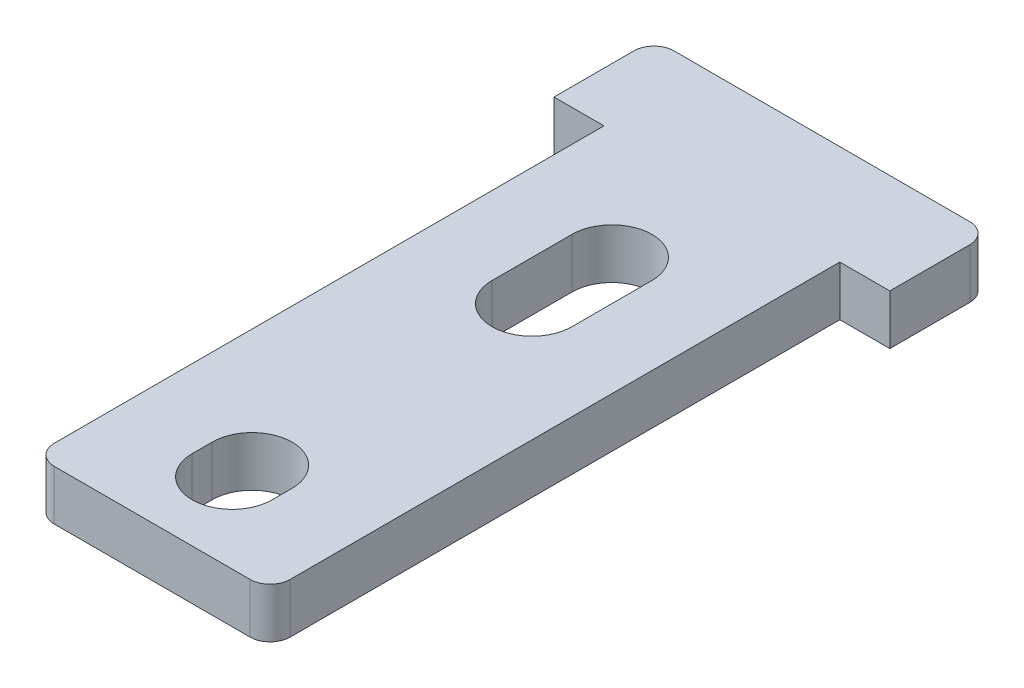
ISO-10303-21;
HEADER;
FILE_DESCRIPTION(('STEP AP214'),'2;1');
FILE_NAME('part.step','',(''),(''),'','','');
FILE_SCHEMA(('AUTOMOTIVE_DESIGN { 1 0 10303 214 1 1 1 1 }'));
ENDSEC;
DATA;
#1=APPLICATION_CONTEXT('core data for automotive mechanical design processes');
#2=APPLICATION_PROTOCOL_DEFINITION('international standard','automotive_design',2000,#1);
#3=PRODUCT_CONTEXT('',#1,'mechanical');
#4=PRODUCT('Part','Part','',(#3));
#5=PRODUCT_RELATED_PRODUCT_CATEGORY('part','',(#4));
#6=PRODUCT_DEFINITION_FORMATION('','',#4);
#7=PRODUCT_DEFINITION_CONTEXT('part definition',#1,'design');
#8=PRODUCT_DEFINITION('design','',#6,#7);
#9=PRODUCT_DEFINITION_SHAPE('','',#8);
#10=(LENGTH_UNIT() NAMED_UNIT(*) SI_UNIT(.MILLI.,.METRE.));
#11=(NAMED_UNIT(*) PLANE_ANGLE_UNIT() SI_UNIT($,.RADIAN.));
#12=(NAMED_UNIT(*) SI_UNIT($,.STERADIAN.) SOLID_ANGLE_UNIT());
#13=UNCERTAINTY_MEASURE_WITH_UNIT(LENGTH_MEASURE(1.E-05),#10,'distance_accuracy_value','');
#14=(GEOMETRIC_REPRESENTATION_CONTEXT(3) GLOBAL_UNCERTAINTY_ASSIGNED_CONTEXT((#13)) GLOBAL_UNIT_ASSIGNED_CONTEXT((#10,
#11,#12)) REPRESENTATION_CONTEXT('',''));
#15=CARTESIAN_POINT('',(0.,0.,0.));
#16=DIRECTION('',(0.,0.,1.));
#17=DIRECTION('',(1.,0.,0.));
#18=AXIS2_PLACEMENT_3D('',#15,#16,#17);
#19=CARTESIAN_POINT('',(0.,2.5,-33.5));
#20=DIRECTION('',(0.,0.,-1.));
#21=DIRECTION('',(-1.,0.,0.));
#22=AXIS2_PLACEMENT_3D('',#19,#20,#21);
#23=PLANE('',#22);
#24=DIRECTION('',(1.,0.,0.));
#25=VECTOR('',#24,1.);
#26=CARTESIAN_POINT('',(0.,0.,-33.5));
#27=LINE('',#26,#25);
#28=CARTESIAN_POINT('',(-2.49999999999999,0.,-33.5));
#29=VERTEX_POINT('',#28);
#30=CARTESIAN_POINT('',(12.3,0.,-33.5));
#31=VERTEX_POINT('',#30);
#32=EDGE_CURVE('E272',#29,#31,#27,.T.);
#33=ORIENTED_EDGE('',*,*,#32,.F.);
#34=DIRECTION('',(0.,-1.,0.));
#35=VECTOR('',#34,1.);
#36=CARTESIAN_POINT('',(-2.49999999999999,2.5,-33.5));
#37=LINE('',#36,#35);
#38=CARTESIAN_POINT('',(-2.49999999999999,2.5,-33.5));
#39=VERTEX_POINT('',#38);
#40=EDGE_CURVE('E11',#39,#29,#37,.T.);
#41=ORIENTED_EDGE('',*,*,#40,.F.);
#42=DIRECTION('',(1.,0.,0.));
#43=VECTOR('',#42,1.);
#44=CARTESIAN_POINT('',(0.,2.5,-33.5));
#45=LINE('',#44,#43);
#46=CARTESIAN_POINT('',(12.3,2.5,-33.5));
#47=VERTEX_POINT('',#46);
#48=EDGE_CURVE('E324',#39,#47,#45,.T.);
#49=ORIENTED_EDGE('',*,*,#48,.T.);
#50=DIRECTION('',(0.,-1.,0.));
#51=VECTOR('',#50,1.);
#52=CARTESIAN_POINT('',(12.3,2.5,-33.5));
#53=LINE('',#52,#51);
#54=EDGE_CURVE('E52',#47,#31,#53,.T.);
#55=ORIENTED_EDGE('',*,*,#54,.T.);
#56=EDGE_LOOP('',(#33,#41,#49,#55));
#57=FACE_BOUND('',#56,.T.);
#58=ADVANCED_FACE('F33',(#57),#23,.T.);
#59=CARTESIAN_POINT('',(-2.5,2.5,-32.5));
#60=DIRECTION('',(0.,-1.,0.));
#61=DIRECTION('',(0.,0.,-1.));
#62=AXIS2_PLACEMENT_3D('',#59,#60,#61);
#63=CYLINDRICAL_SURFACE('',#62,1.);
#64=CARTESIAN_POINT('',(-2.5,0.,-32.5));
#65=DIRECTION('',(0.,1.,0.));
#66=DIRECTION('',(0.,0.,1.));
#67=AXIS2_PLACEMENT_3D('',#64,#65,#66);
#68=CIRCLE('',#67,1.);
#69=CARTESIAN_POINT('',(-3.5,0.,-32.5));
#70=VERTEX_POINT('',#69);
#71=EDGE_CURVE('E274',#29,#70,#68,.T.);
#72=ORIENTED_EDGE('',*,*,#71,.T.);
#73=DIRECTION('',(0.,-1.,0.));
#74=VECTOR('',#73,1.);
#75=CARTESIAN_POINT('',(-3.5,2.5,-32.5));
#76=LINE('',#75,#74);
#77=CARTESIAN_POINT('',(-3.5,2.5,-32.5));
#78=VERTEX_POINT('',#77);
#79=EDGE_CURVE('E43',#78,#70,#76,.T.);
#80=ORIENTED_EDGE('',*,*,#79,.F.);
#81=CARTESIAN_POINT('',(-2.5,2.5,-32.5));
#82=DIRECTION('',(0.,1.,0.));
#83=DIRECTION('',(0.,0.,1.));
#84=AXIS2_PLACEMENT_3D('',#81,#82,#83);
#85=CIRCLE('',#84,1.);
#86=EDGE_CURVE('E326',#39,#78,#85,.T.);
#87=ORIENTED_EDGE('',*,*,#86,.F.);
#88=ORIENTED_EDGE('',*,*,#40,.T.);
#89=EDGE_LOOP('',(#72,#80,#87,#88));
#90=FACE_BOUND('',#89,.T.);
#91=ADVANCED_FACE('F351',(#90),#63,.T.);
#92=CARTESIAN_POINT('',(-3.5,2.5,0.));
#93=DIRECTION('',(-1.,0.,0.));
#94=DIRECTION('',(0.,0.,1.));
#95=AXIS2_PLACEMENT_3D('',#92,#93,#94);
#96=PLANE('',#95);
#97=DIRECTION('',(0.,0.,-1.));
#98=VECTOR('',#97,1.);
#99=CARTESIAN_POINT('',(-3.5,0.,0.));
#100=LINE('',#99,#98);
#101=CARTESIAN_POINT('',(-3.5,0.,-28.5));
#102=VERTEX_POINT('',#101);
#103=EDGE_CURVE('E277',#102,#70,#100,.T.);
#104=ORIENTED_EDGE('',*,*,#103,.F.);
#105=DIRECTION('',(0.,-1.,0.));
#106=VECTOR('',#105,1.);
#107=CARTESIAN_POINT('',(-3.5,2.5,-28.5));
#108=LINE('',#107,#106);
#109=CARTESIAN_POINT('',(-3.5,2.5,-28.5));
#110=VERTEX_POINT('',#109);
#111=EDGE_CURVE('E217',#110,#102,#108,.T.);
#112=ORIENTED_EDGE('',*,*,#111,.F.);
#113=DIRECTION('',(0.,0.,-1.));
#114=VECTOR('',#113,1.);
#115=CARTESIAN_POINT('',(-3.5,2.5,0.));
#116=LINE('',#115,#114);
#117=EDGE_CURVE('E328',#110,#78,#116,.T.);
#118=ORIENTED_EDGE('',*,*,#117,.T.);
#119=ORIENTED_EDGE('',*,*,#79,.T.);
#120=EDGE_LOOP('',(#104,#112,#118,#119));
#121=FACE_BOUND('',#120,.T.);
#122=ADVANCED_FACE('F354',(#121),#96,.T.);
#123=CARTESIAN_POINT('',(0.,2.5,-28.5));
#124=DIRECTION('',(0.,0.,1.));
#125=DIRECTION('',(1.,0.,0.));
#126=AXIS2_PLACEMENT_3D('',#123,#124,#125);
#127=PLANE('',#126);
#128=DIRECTION('',(-1.,0.,0.));
#129=VECTOR('',#128,1.);
#130=CARTESIAN_POINT('',(0.,0.,-28.5));
#131=LINE('',#130,#129);
#132=CARTESIAN_POINT('',(-1.,0.,-28.5));
#133=VERTEX_POINT('',#132);
#134=EDGE_CURVE('E280',#133,#102,#131,.T.);
#135=ORIENTED_EDGE('',*,*,#134,.F.);
#136=DIRECTION('',(0.,-1.,0.));
#137=VECTOR('',#136,1.);
#138=CARTESIAN_POINT('',(-1.,2.5,-28.5));
#139=LINE('',#138,#137);
#140=CARTESIAN_POINT('',(-1.,2.5,-28.5));
#141=VERTEX_POINT('',#140);
#142=EDGE_CURVE('E215',#141,#133,#139,.T.);
#143=ORIENTED_EDGE('',*,*,#142,.F.);
#144=DIRECTION('',(-1.,0.,0.));
#145=VECTOR('',#144,1.);
#146=CARTESIAN_POINT('',(0.,2.5,-28.5));
#147=LINE('',#146,#145);
#148=EDGE_CURVE('E331',#141,#110,#147,.T.);
#149=ORIENTED_EDGE('',*,*,#148,.T.);
#150=ORIENTED_EDGE('',*,*,#111,.T.);
#151=EDGE_LOOP('',(#135,#143,#149,#150));
#152=FACE_BOUND('',#151,.T.);
#153=ADVANCED_FACE('F359',(#152),#127,.T.);
#154=CARTESIAN_POINT('',(-1.,2.5,0.));
#155=DIRECTION('',(-1.,0.,0.));
#156=DIRECTION('',(0.,0.,1.));
#157=AXIS2_PLACEMENT_3D('',#154,#155,#156);
#158=PLANE('',#157);
#159=DIRECTION('',(0.,0.,-1.));
#160=VECTOR('',#159,1.);
#161=CARTESIAN_POINT('',(-1.,0.,0.));
#162=LINE('',#161,#160);
#163=CARTESIAN_POINT('',(-1.,0.,-1.00000000000001));
#164=VERTEX_POINT('',#163);
#165=EDGE_CURVE('E283',#164,#133,#162,.T.);
#166=ORIENTED_EDGE('',*,*,#165,.F.);
#167=DIRECTION('',(0.,-1.,0.));
#168=VECTOR('',#167,1.);
#169=CARTESIAN_POINT('',(-1.,2.5,-1.00000000000001));
#170=LINE('',#169,#168);
#171=CARTESIAN_POINT('',(-1.,2.5,-1.00000000000001));
#172=VERTEX_POINT('',#171);
#173=EDGE_CURVE('E213',#172,#164,#170,.T.);
#174=ORIENTED_EDGE('',*,*,#173,.F.);
#175=DIRECTION('',(0.,0.,-1.));
#176=VECTOR('',#175,1.);
#177=CARTESIAN_POINT('',(-1.,2.5,0.));
#178=LINE('',#177,#176);
#179=EDGE_CURVE('E334',#172,#141,#178,.T.);
#180=ORIENTED_EDGE('',*,*,#179,.T.);
#181=ORIENTED_EDGE('',*,*,#142,.T.);
#182=EDGE_LOOP('',(#166,#174,#180,#181));
#183=FACE_BOUND('',#182,.T.);
#184=ADVANCED_FACE('F362',(#183),#158,.T.);
#185=CARTESIAN_POINT('',(0.,2.5,-1.));
#186=DIRECTION('',(0.,-1.,0.));
#187=DIRECTION('',(0.,0.,-1.));
#188=AXIS2_PLACEMENT_3D('',#185,#186,#187);
#189=CYLINDRICAL_SURFACE('',#188,1.);
#190=CARTESIAN_POINT('',(0.,0.,-1.));
#191=DIRECTION('',(0.,1.,0.));
#192=DIRECTION('',(0.,0.,1.));
#193=AXIS2_PLACEMENT_3D('',#190,#191,#192);
#194=CIRCLE('',#193,1.);
#195=CARTESIAN_POINT('',(0.,0.,0.));
#196=VERTEX_POINT('',#195);
#197=EDGE_CURVE('E286',#196,#164,#194,.F.);
#198=ORIENTED_EDGE('',*,*,#197,.F.);
#199=DIRECTION('',(0.,-1.,0.));
#200=VECTOR('',#199,1.);
#201=CARTESIAN_POINT('',(0.,2.5,0.));
#202=LINE('',#201,#200);
#203=CARTESIAN_POINT('',(0.,2.5,0.));
#204=VERTEX_POINT('',#203);
#205=EDGE_CURVE('E211',#204,#196,#202,.T.);
#206=ORIENTED_EDGE('',*,*,#205,.F.);
#207=CARTESIAN_POINT('',(0.,2.5,-1.));
#208=DIRECTION('',(0.,1.,0.));
#209=DIRECTION('',(0.,0.,1.));
#210=AXIS2_PLACEMENT_3D('',#207,#208,#209);
#211=CIRCLE('',#210,1.);
#212=EDGE_CURVE('E337',#204,#172,#211,.F.);
#213=ORIENTED_EDGE('',*,*,#212,.T.);
#214=ORIENTED_EDGE('',*,*,#173,.T.);
#215=EDGE_LOOP('',(#198,#206,#213,#214));
#216=FACE_BOUND('',#215,.T.);
#217=ADVANCED_FACE('F366',(#216),#189,.T.);
#218=CARTESIAN_POINT('',(0.,2.5,0.));
#219=DIRECTION('',(0.,0.,-1.));
#220=DIRECTION('',(-1.,0.,0.));
#221=AXIS2_PLACEMENT_3D('',#218,#219,#220);
#222=PLANE('',#221);
#223=DIRECTION('',(1.,0.,0.));
#224=VECTOR('',#223,1.);
#225=CARTESIAN_POINT('',(0.,0.,0.));
#226=LINE('',#225,#224);
#227=CARTESIAN_POINT('',(9.79999999999999,0.,0.));
#228=VERTEX_POINT('',#227);
#229=EDGE_CURVE('E289',#196,#228,#226,.T.);
#230=ORIENTED_EDGE('',*,*,#229,.T.);
#231=DIRECTION('',(0.,-1.,0.));
#232=VECTOR('',#231,1.);
#233=CARTESIAN_POINT('',(9.79999999999999,2.5,0.));
#234=LINE('',#233,#232);
#235=CARTESIAN_POINT('',(9.79999999999999,2.5,0.));
#236=VERTEX_POINT('',#235);
#237=EDGE_CURVE('E208',#236,#228,#234,.T.);
#238=ORIENTED_EDGE('',*,*,#237,.F.);
#239=DIRECTION('',(1.,0.,0.));
#240=VECTOR('',#239,1.);
#241=CARTESIAN_POINT('',(0.,2.5,0.));
#242=LINE('',#241,#240);
#243=EDGE_CURVE('E340',#204,#236,#242,.T.);
#244=ORIENTED_EDGE('',*,*,#243,.F.);
#245=ORIENTED_EDGE('',*,*,#205,.T.);
#246=EDGE_LOOP('',(#230,#238,#244,#245));
#247=FACE_BOUND('',#246,.T.);
#248=ADVANCED_FACE('F371',(#247),#222,.F.);
#249=CARTESIAN_POINT('',(9.8,2.5,-1.));
#250=DIRECTION('',(0.,-1.,0.));
#251=DIRECTION('',(0.,0.,-1.));
#252=AXIS2_PLACEMENT_3D('',#249,#250,#251);
#253=CYLINDRICAL_SURFACE('',#252,1.);
#254=CARTESIAN_POINT('',(9.8,0.,-1.));
#255=DIRECTION('',(0.,1.,0.));
#256=DIRECTION('',(0.,0.,1.));
#257=AXIS2_PLACEMENT_3D('',#254,#255,#256);
#258=CIRCLE('',#257,1.);
#259=CARTESIAN_POINT('',(10.8,0.,-1.00000000000001));
#260=VERTEX_POINT('',#259);
#261=EDGE_CURVE('E292',#228,#260,#258,.T.);
#262=ORIENTED_EDGE('',*,*,#261,.T.);
#263=DIRECTION('',(0.,-1.,0.));
#264=VECTOR('',#263,1.);
#265=CARTESIAN_POINT('',(10.8,2.5,-1.00000000000001));
#266=LINE('',#265,#264);
#267=CARTESIAN_POINT('',(10.8,2.5,-1.00000000000001));
#268=VERTEX_POINT('',#267);
#269=EDGE_CURVE('E201',#268,#260,#266,.T.);
#270=ORIENTED_EDGE('',*,*,#269,.F.);
#271=CARTESIAN_POINT('',(9.8,2.5,-1.));
#272=DIRECTION('',(0.,1.,0.));
#273=DIRECTION('',(0.,0.,1.));
#274=AXIS2_PLACEMENT_3D('',#271,#272,#273);
#275=CIRCLE('',#274,1.);
#276=EDGE_CURVE('E343',#236,#268,#275,.T.);
#277=ORIENTED_EDGE('',*,*,#276,.F.);
#278=ORIENTED_EDGE('',*,*,#237,.T.);
#279=EDGE_LOOP('',(#262,#270,#277,#278));
#280=FACE_BOUND('',#279,.T.);
#281=ADVANCED_FACE('F374',(#280),#253,.T.);
#282=CARTESIAN_POINT('',(10.8,2.5,0.));
#283=DIRECTION('',(-1.,0.,0.));
#284=DIRECTION('',(0.,0.,1.));
#285=AXIS2_PLACEMENT_3D('',#282,#283,#284);
#286=PLANE('',#285);
#287=DIRECTION('',(0.,0.,-1.));
#288=VECTOR('',#287,1.);
#289=CARTESIAN_POINT('',(10.8,0.,0.));
#290=LINE('',#289,#288);
#291=CARTESIAN_POINT('',(10.8,0.,-28.5));
#292=VERTEX_POINT('',#291);
#293=EDGE_CURVE('E295',#260,#292,#290,.T.);
#294=ORIENTED_EDGE('',*,*,#293,.T.);
#295=DIRECTION('',(0.,-1.,0.));
#296=VECTOR('',#295,1.);
#297=CARTESIAN_POINT('',(10.8,2.5,-28.5));
#298=LINE('',#297,#296);
#299=CARTESIAN_POINT('',(10.8,2.5,-28.5));
#300=VERTEX_POINT('',#299);
#301=EDGE_CURVE('E199',#300,#292,#298,.T.);
#302=ORIENTED_EDGE('',*,*,#301,.F.);
#303=DIRECTION('',(0.,0.,-1.));
#304=VECTOR('',#303,1.);
#305=CARTESIAN_POINT('',(10.8,2.5,0.));
#306=LINE('',#305,#304);
#307=EDGE_CURVE('E192',#268,#300,#306,.T.);
#308=ORIENTED_EDGE('',*,*,#307,.F.);
#309=ORIENTED_EDGE('',*,*,#269,.T.);
#310=EDGE_LOOP('',(#294,#302,#308,#309));
#311=FACE_BOUND('',#310,.T.);
#312=ADVANCED_FACE('F376',(#311),#286,.F.);
#313=CARTESIAN_POINT('',(0.,2.5,-28.5));
#314=DIRECTION('',(0.,0.,-1.));
#315=DIRECTION('',(-1.,0.,0.));
#316=AXIS2_PLACEMENT_3D('',#313,#314,#315);
#317=PLANE('',#316);
#318=DIRECTION('',(1.,0.,0.));
#319=VECTOR('',#318,1.);
#320=CARTESIAN_POINT('',(0.,0.,-28.5));
#321=LINE('',#320,#319);
#322=CARTESIAN_POINT('',(13.3,0.,-28.5));
#323=VERTEX_POINT('',#322);
#324=EDGE_CURVE('E198',#292,#323,#321,.T.);
#325=ORIENTED_EDGE('',*,*,#324,.T.);
#326=DIRECTION('',(0.,-1.,0.));
#327=VECTOR('',#326,1.);
#328=CARTESIAN_POINT('',(13.3,2.5,-28.5));
#329=LINE('',#328,#327);
#330=CARTESIAN_POINT('',(13.3,2.5,-28.5));
#331=VERTEX_POINT('',#330);
#332=EDGE_CURVE('E181',#331,#323,#329,.T.);
#333=ORIENTED_EDGE('',*,*,#332,.F.);
#334=DIRECTION('',(1.,0.,0.));
#335=VECTOR('',#334,1.);
#336=CARTESIAN_POINT('',(0.,2.5,-28.5));
#337=LINE('',#336,#335);
#338=EDGE_CURVE('E186',#300,#331,#337,.T.);
#339=ORIENTED_EDGE('',*,*,#338,.F.);
#340=ORIENTED_EDGE('',*,*,#301,.T.);
#341=EDGE_LOOP('',(#325,#333,#339,#340));
#342=FACE_BOUND('',#341,.T.);
#343=ADVANCED_FACE('F197',(#342),#317,.F.);
#344=CARTESIAN_POINT('',(13.3,2.5,0.));
#345=DIRECTION('',(-1.,0.,0.));
#346=DIRECTION('',(0.,0.,1.));
#347=AXIS2_PLACEMENT_3D('',#344,#345,#346);
#348=PLANE('',#347);
#349=DIRECTION('',(0.,0.,-1.));
#350=VECTOR('',#349,1.);
#351=CARTESIAN_POINT('',(13.3,0.,0.));
#352=LINE('',#351,#350);
#353=CARTESIAN_POINT('',(13.3,0.,-32.5));
#354=VERTEX_POINT('',#353);
#355=EDGE_CURVE('E299',#323,#354,#352,.T.);
#356=ORIENTED_EDGE('',*,*,#355,.T.);
#357=DIRECTION('',(0.,-1.,0.));
#358=VECTOR('',#357,1.);
#359=CARTESIAN_POINT('',(13.3,2.5,-32.5));
#360=LINE('',#359,#358);
#361=CARTESIAN_POINT('',(13.3,2.5,-32.5));
#362=VERTEX_POINT('',#361);
#363=EDGE_CURVE('E114',#362,#354,#360,.T.);
#364=ORIENTED_EDGE('',*,*,#363,.F.);
#365=DIRECTION('',(0.,0.,-1.));
#366=VECTOR('',#365,1.);
#367=CARTESIAN_POINT('',(13.3,2.5,0.));
#368=LINE('',#367,#366);
#369=EDGE_CURVE('E177',#331,#362,#368,.T.);
#370=ORIENTED_EDGE('',*,*,#369,.F.);
#371=ORIENTED_EDGE('',*,*,#332,.T.);
#372=EDGE_LOOP('',(#356,#364,#370,#371));
#373=FACE_BOUND('',#372,.T.);
#374=ADVANCED_FACE('F179',(#373),#348,.F.);
#375=CARTESIAN_POINT('',(4.9,2.5,-5.));
#376=DIRECTION('',(0.,-1.,0.));
#377=DIRECTION('',(0.,0.,-1.));
#378=AXIS2_PLACEMENT_3D('',#375,#376,#377);
#379=CYLINDRICAL_SURFACE('',#378,2.);
#380=CARTESIAN_POINT('',(4.9,0.,-5.));
#381=DIRECTION('',(0.,1.,0.));
#382=DIRECTION('',(0.,0.,1.));
#383=AXIS2_PLACEMENT_3D('',#380,#381,#382);
#384=CIRCLE('',#383,2.);
#385=CARTESIAN_POINT('',(6.9,0.,-5.));
#386=VERTEX_POINT('',#385);
#387=CARTESIAN_POINT('',(2.9,0.,-5.));
#388=VERTEX_POINT('',#387);
#389=EDGE_CURVE('E260',#386,#388,#384,.T.);
#390=ORIENTED_EDGE('',*,*,#389,.F.);
#391=DIRECTION('',(0.,-1.,0.));
#392=VECTOR('',#391,1.);
#393=CARTESIAN_POINT('',(6.9,2.5,-5.));
#394=LINE('',#393,#392);
#395=CARTESIAN_POINT('',(6.9,2.5,-5.));
#396=VERTEX_POINT('',#395);
#397=EDGE_CURVE('E226',#396,#386,#394,.T.);
#398=ORIENTED_EDGE('',*,*,#397,.F.);
#399=CARTESIAN_POINT('',(4.9,2.5,-5.));
#400=DIRECTION('',(0.,1.,0.));
#401=DIRECTION('',(0.,0.,1.));
#402=AXIS2_PLACEMENT_3D('',#399,#400,#401);
#403=CIRCLE('',#402,2.);
#404=CARTESIAN_POINT('',(2.9,2.5,-5.));
#405=VERTEX_POINT('',#404);
#406=EDGE_CURVE('E312',#396,#405,#403,.T.);
#407=ORIENTED_EDGE('',*,*,#406,.T.);
#408=DIRECTION('',(0.,-1.,0.));
#409=VECTOR('',#408,1.);
#410=CARTESIAN_POINT('',(2.9,2.5,-5.));
#411=LINE('',#410,#409);
#412=EDGE_CURVE('E220',#405,#388,#411,.T.);
#413=ORIENTED_EDGE('',*,*,#412,.T.);
#414=EDGE_LOOP('',(#390,#398,#407,#413));
#415=FACE_BOUND('',#414,.T.);
#416=ADVANCED_FACE('F406',(#415),#379,.F.);
#417=CARTESIAN_POINT('',(6.9,2.5,0.));
#418=DIRECTION('',(-1.,0.,0.));
#419=DIRECTION('',(0.,0.,1.));
#420=AXIS2_PLACEMENT_3D('',#417,#418,#419);
#421=PLANE('',#420);
#422=DIRECTION('',(0.,0.,-1.));
#423=VECTOR('',#422,1.);
#424=CARTESIAN_POINT('',(6.9,0.,0.));
#425=LINE('',#424,#423);
#426=CARTESIAN_POINT('',(6.9,0.,-4.));
#427=VERTEX_POINT('',#426);
#428=EDGE_CURVE('E263',#427,#386,#425,.T.);
#429=ORIENTED_EDGE('',*,*,#428,.F.);
#430=DIRECTION('',(0.,-1.,0.));
#431=VECTOR('',#430,1.);
#432=CARTESIAN_POINT('',(6.9,2.5,-4.));
#433=LINE('',#432,#431);
#434=CARTESIAN_POINT('',(6.9,2.5,-4.));
#435=VERTEX_POINT('',#434);
#436=EDGE_CURVE('E224',#435,#427,#433,.T.);
#437=ORIENTED_EDGE('',*,*,#436,.F.);
#438=DIRECTION('',(0.,0.,-1.));
#439=VECTOR('',#438,1.);
#440=CARTESIAN_POINT('',(6.9,2.5,0.));
#441=LINE('',#440,#439);
#442=EDGE_CURVE('E315',#435,#396,#441,.T.);
#443=ORIENTED_EDGE('',*,*,#442,.T.);
#444=ORIENTED_EDGE('',*,*,#397,.T.);
#445=EDGE_LOOP('',(#429,#437,#443,#444));
#446=FACE_BOUND('',#445,.T.);
#447=ADVANCED_FACE('F402',(#446),#421,.T.);
#448=CARTESIAN_POINT('',(4.9,2.5,-4.));
#449=DIRECTION('',(0.,-1.,0.));
#450=DIRECTION('',(0.,0.,-1.));
#451=AXIS2_PLACEMENT_3D('',#448,#449,#450);
#452=CYLINDRICAL_SURFACE('',#451,2.);
#453=CARTESIAN_POINT('',(4.9,0.,-4.));
#454=DIRECTION('',(0.,1.,0.));
#455=DIRECTION('',(0.,0.,1.));
#456=AXIS2_PLACEMENT_3D('',#453,#454,#455);
#457=CIRCLE('',#456,2.);
#458=CARTESIAN_POINT('',(2.9,0.,-4.));
#459=VERTEX_POINT('',#458);
#460=EDGE_CURVE('E266',#459,#427,#457,.T.);
#461=ORIENTED_EDGE('',*,*,#460,.F.);
#462=DIRECTION('',(0.,-1.,0.));
#463=VECTOR('',#462,1.);
#464=CARTESIAN_POINT('',(2.9,2.5,-4.));
#465=LINE('',#464,#463);
#466=CARTESIAN_POINT('',(2.9,2.5,-4.));
#467=VERTEX_POINT('',#466);
#468=EDGE_CURVE('E222',#467,#459,#465,.T.);
#469=ORIENTED_EDGE('',*,*,#468,.F.);
#470=CARTESIAN_POINT('',(4.9,2.5,-4.));
#471=DIRECTION('',(0.,1.,0.));
#472=DIRECTION('',(0.,0.,1.));
#473=AXIS2_PLACEMENT_3D('',#470,#471,#472);
#474=CIRCLE('',#473,2.);
#475=EDGE_CURVE('E318',#467,#435,#474,.T.);
#476=ORIENTED_EDGE('',*,*,#475,.T.);
#477=ORIENTED_EDGE('',*,*,#436,.T.);
#478=EDGE_LOOP('',(#461,#469,#476,#477));
#479=FACE_BOUND('',#478,.T.);
#480=ADVANCED_FACE('F399',(#479),#452,.F.);
#481=CARTESIAN_POINT('',(4.9,2.5,-23.));
#482=DIRECTION('',(0.,-1.,0.));
#483=DIRECTION('',(0.,0.,-1.));
#484=AXIS2_PLACEMENT_3D('',#481,#482,#483);
#485=CYLINDRICAL_SURFACE('',#484,2.);
#486=CARTESIAN_POINT('',(4.9,0.,-23.));
#487=DIRECTION('',(0.,1.,0.));
#488=DIRECTION('',(0.,0.,1.));
#489=AXIS2_PLACEMENT_3D('',#486,#487,#488);
#490=CIRCLE('',#489,2.);
#491=CARTESIAN_POINT('',(6.9,0.,-23.));
#492=VERTEX_POINT('',#491);
#493=CARTESIAN_POINT('',(2.9,0.,-23.));
#494=VERTEX_POINT('',#493);
#495=EDGE_CURVE('E245',#492,#494,#490,.T.);
#496=ORIENTED_EDGE('',*,*,#495,.F.);
#497=DIRECTION('',(0.,-1.,0.));
#498=VECTOR('',#497,1.);
#499=CARTESIAN_POINT('',(6.9,2.5,-23.));
#500=LINE('',#499,#498);
#501=CARTESIAN_POINT('',(6.9,2.5,-23.));
#502=VERTEX_POINT('',#501);
#503=EDGE_CURVE('E37',#502,#492,#500,.T.);
#504=ORIENTED_EDGE('',*,*,#503,.F.);
#505=CARTESIAN_POINT('',(4.9,2.5,-23.));
#506=DIRECTION('',(0.,1.,0.));
#507=DIRECTION('',(0.,0.,1.));
#508=AXIS2_PLACEMENT_3D('',#505,#506,#507);
#509=CIRCLE('',#508,2.);
#510=CARTESIAN_POINT('',(2.9,2.5,-23.));
#511=VERTEX_POINT('',#510);
#512=EDGE_CURVE('E303',#502,#511,#509,.T.);
#513=ORIENTED_EDGE('',*,*,#512,.T.);
#514=DIRECTION('',(0.,-1.,0.));
#515=VECTOR('',#514,1.);
#516=CARTESIAN_POINT('',(2.9,2.5,-23.));
#517=LINE('',#516,#515);
#518=EDGE_CURVE('E228',#511,#494,#517,.T.);
#519=ORIENTED_EDGE('',*,*,#518,.T.);
#520=EDGE_LOOP('',(#496,#504,#513,#519));
#521=FACE_BOUND('',#520,.T.);
#522=ADVANCED_FACE('F35',(#521),#485,.F.);
#523=CARTESIAN_POINT('',(6.9,2.5,0.));
#524=DIRECTION('',(-1.,0.,0.));
#525=DIRECTION('',(0.,0.,1.));
#526=AXIS2_PLACEMENT_3D('',#523,#524,#525);
#527=PLANE('',#526);
#528=DIRECTION('',(0.,0.,-1.));
#529=VECTOR('',#528,1.);
#530=CARTESIAN_POINT('',(6.9,0.,0.));
#531=LINE('',#530,#529);
#532=CARTESIAN_POINT('',(6.9,0.,-19.));
#533=VERTEX_POINT('',#532);
#534=EDGE_CURVE('E240',#533,#492,#531,.T.);
#535=ORIENTED_EDGE('',*,*,#534,.F.);
#536=DIRECTION('',(0.,-1.,0.));
#537=VECTOR('',#536,1.);
#538=CARTESIAN_POINT('',(6.9,2.5,-19.));
#539=LINE('',#538,#537);
#540=CARTESIAN_POINT('',(6.9,2.5,-19.));
#541=VERTEX_POINT('',#540);
#542=EDGE_CURVE('E231',#541,#533,#539,.T.);
#543=ORIENTED_EDGE('',*,*,#542,.F.);
#544=DIRECTION('',(0.,0.,-1.));
#545=VECTOR('',#544,1.);
#546=CARTESIAN_POINT('',(6.9,2.5,0.));
#547=LINE('',#546,#545);
#548=EDGE_CURVE('E243',#541,#502,#547,.T.);
#549=ORIENTED_EDGE('',*,*,#548,.T.);
#550=ORIENTED_EDGE('',*,*,#503,.T.);
#551=EDGE_LOOP('',(#535,#543,#549,#550));
#552=FACE_BOUND('',#551,.T.);
#553=ADVANCED_FACE('F238',(#552),#527,.T.);
#554=CARTESIAN_POINT('',(4.9,2.5,-19.));
#555=DIRECTION('',(0.,-1.,0.));
#556=DIRECTION('',(0.,0.,-1.));
#557=AXIS2_PLACEMENT_3D('',#554,#555,#556);
#558=CYLINDRICAL_SURFACE('',#557,2.);
#559=CARTESIAN_POINT('',(4.9,0.,-19.));
#560=DIRECTION('',(0.,1.,0.));
#561=DIRECTION('',(0.,0.,1.));
#562=AXIS2_PLACEMENT_3D('',#559,#560,#561);
#563=CIRCLE('',#562,2.);
#564=CARTESIAN_POINT('',(2.9,0.,-19.));
#565=VERTEX_POINT('',#564);
#566=EDGE_CURVE('E253',#565,#533,#563,.T.);
#567=ORIENTED_EDGE('',*,*,#566,.F.);
#568=DIRECTION('',(0.,-1.,0.));
#569=VECTOR('',#568,1.);
#570=CARTESIAN_POINT('',(2.9,2.5,-19.));
#571=LINE('',#570,#569);
#572=CARTESIAN_POINT('',(2.9,2.5,-19.));
#573=VERTEX_POINT('',#572);
#574=EDGE_CURVE('E230',#573,#565,#571,.T.);
#575=ORIENTED_EDGE('',*,*,#574,.F.);
#576=CARTESIAN_POINT('',(4.9,2.5,-19.));
#577=DIRECTION('',(0.,1.,0.));
#578=DIRECTION('',(0.,0.,1.));
#579=AXIS2_PLACEMENT_3D('',#576,#577,#578);
#580=CIRCLE('',#579,2.);
#581=EDGE_CURVE('E306',#573,#541,#580,.T.);
#582=ORIENTED_EDGE('',*,*,#581,.T.);
#583=ORIENTED_EDGE('',*,*,#542,.T.);
#584=EDGE_LOOP('',(#567,#575,#582,#583));
#585=FACE_BOUND('',#584,.T.);
#586=ADVANCED_FACE('F397',(#585),#558,.F.);
#587=CARTESIAN_POINT('',(2.9,2.5,0.));
#588=DIRECTION('',(1.,0.,0.));
#589=DIRECTION('',(0.,0.,-1.));
#590=AXIS2_PLACEMENT_3D('',#587,#588,#589);
#591=PLANE('',#590);
#592=DIRECTION('',(0.,0.,1.));
#593=VECTOR('',#592,1.);
#594=CARTESIAN_POINT('',(2.9,0.,0.));
#595=LINE('',#594,#593);
#596=EDGE_CURVE('E269',#388,#459,#595,.T.);
#597=ORIENTED_EDGE('',*,*,#596,.F.);
#598=ORIENTED_EDGE('',*,*,#412,.F.);
#599=DIRECTION('',(0.,0.,1.));
#600=VECTOR('',#599,1.);
#601=CARTESIAN_POINT('',(2.9,2.5,0.));
#602=LINE('',#601,#600);
#603=EDGE_CURVE('E321',#405,#467,#602,.T.);
#604=ORIENTED_EDGE('',*,*,#603,.T.);
#605=ORIENTED_EDGE('',*,*,#468,.T.);
#606=EDGE_LOOP('',(#597,#598,#604,#605));
#607=FACE_BOUND('',#606,.T.);
#608=ADVANCED_FACE('F393',(#607),#591,.T.);
#609=CARTESIAN_POINT('',(2.9,2.5,0.));
#610=DIRECTION('',(-1.,0.,0.));
#611=DIRECTION('',(0.,0.,1.));
#612=AXIS2_PLACEMENT_3D('',#609,#610,#611);
#613=PLANE('',#612);
#614=DIRECTION('',(0.,0.,-1.));
#615=VECTOR('',#614,1.);
#616=CARTESIAN_POINT('',(2.9,0.,0.));
#617=LINE('',#616,#615);
#618=EDGE_CURVE('E255',#565,#494,#617,.T.);
#619=ORIENTED_EDGE('',*,*,#618,.T.);
#620=ORIENTED_EDGE('',*,*,#518,.F.);
#621=DIRECTION('',(0.,0.,-1.));
#622=VECTOR('',#621,1.);
#623=CARTESIAN_POINT('',(2.9,2.5,0.));
#624=LINE('',#623,#622);
#625=EDGE_CURVE('E310',#573,#511,#624,.T.);
#626=ORIENTED_EDGE('',*,*,#625,.F.);
#627=ORIENTED_EDGE('',*,*,#574,.T.);
#628=EDGE_LOOP('',(#619,#620,#626,#627));
#629=FACE_BOUND('',#628,.T.);
#630=ADVANCED_FACE('F396',(#629),#613,.F.);
#631=CARTESIAN_POINT('',(12.3,2.5,-32.5));
#632=DIRECTION('',(0.,-1.,0.));
#633=DIRECTION('',(0.,0.,-1.));
#634=AXIS2_PLACEMENT_3D('',#631,#632,#633);
#635=CYLINDRICAL_SURFACE('',#634,1.);
#636=CARTESIAN_POINT('',(12.3,0.,-32.5));
#637=DIRECTION('',(0.,1.,0.));
#638=DIRECTION('',(0.,0.,1.));
#639=AXIS2_PLACEMENT_3D('',#636,#637,#638);
#640=CIRCLE('',#639,1.);
#641=EDGE_CURVE('E301',#31,#354,#640,.F.);
#642=ORIENTED_EDGE('',*,*,#641,.F.);
#643=ORIENTED_EDGE('',*,*,#54,.F.);
#644=CARTESIAN_POINT('',(12.3,2.5,-32.5));
#645=DIRECTION('',(0.,1.,0.));
#646=DIRECTION('',(0.,0.,1.));
#647=AXIS2_PLACEMENT_3D('',#644,#645,#646);
#648=CIRCLE('',#647,1.);
#649=EDGE_CURVE('E185',#47,#362,#648,.F.);
#650=ORIENTED_EDGE('',*,*,#649,.T.);
#651=ORIENTED_EDGE('',*,*,#363,.T.);
#652=EDGE_LOOP('',(#642,#643,#650,#651));
#653=FACE_BOUND('',#652,.T.);
#654=ADVANCED_FACE('F345',(#653),#635,.T.);
#655=CARTESIAN_POINT('',(0.,2.5,0.));
#656=DIRECTION('',(0.,1.,0.));
#657=DIRECTION('',(0.,0.,1.));
#658=AXIS2_PLACEMENT_3D('',#655,#656,#657);
#659=PLANE('',#658);
#660=ORIENTED_EDGE('',*,*,#512,.F.);
#661=ORIENTED_EDGE('',*,*,#548,.F.);
#662=ORIENTED_EDGE('',*,*,#581,.F.);
#663=ORIENTED_EDGE('',*,*,#625,.T.);
#664=EDGE_LOOP('',(#660,#661,#662,#663));
#665=FACE_BOUND('',#664,.T.);
#666=ORIENTED_EDGE('',*,*,#406,.F.);
#667=ORIENTED_EDGE('',*,*,#442,.F.);
#668=ORIENTED_EDGE('',*,*,#475,.F.);
#669=ORIENTED_EDGE('',*,*,#603,.F.);
#670=EDGE_LOOP('',(#666,#667,#668,#669));
#671=FACE_BOUND('',#670,.T.);
#672=ORIENTED_EDGE('',*,*,#48,.F.);
#673=ORIENTED_EDGE('',*,*,#86,.T.);
#674=ORIENTED_EDGE('',*,*,#117,.F.);
#675=ORIENTED_EDGE('',*,*,#148,.F.);
#676=ORIENTED_EDGE('',*,*,#179,.F.);
#677=ORIENTED_EDGE('',*,*,#212,.F.);
#678=ORIENTED_EDGE('',*,*,#243,.T.);
#679=ORIENTED_EDGE('',*,*,#276,.T.);
#680=ORIENTED_EDGE('',*,*,#307,.T.);
#681=ORIENTED_EDGE('',*,*,#338,.T.);
#682=ORIENTED_EDGE('',*,*,#369,.T.);
#683=ORIENTED_EDGE('',*,*,#649,.F.);
#684=EDGE_LOOP('',(#672,#673,#674,#675,#676,#677,#678,#679,#680,#681,#682,#683));
#685=FACE_BOUND('',#684,.T.);
#686=ADVANCED_FACE('F190',(#665,#671,#685),#659,.T.);
#687=CARTESIAN_POINT('',(0.,0.,0.));
#688=DIRECTION('',(0.,1.,0.));
#689=DIRECTION('',(0.,0.,1.));
#690=AXIS2_PLACEMENT_3D('',#687,#688,#689);
#691=PLANE('',#690);
#692=ORIENTED_EDGE('',*,*,#495,.T.);
#693=ORIENTED_EDGE('',*,*,#618,.F.);
#694=ORIENTED_EDGE('',*,*,#566,.T.);
#695=ORIENTED_EDGE('',*,*,#534,.T.);
#696=EDGE_LOOP('',(#692,#693,#694,#695));
#697=FACE_BOUND('',#696,.T.);
#698=ORIENTED_EDGE('',*,*,#389,.T.);
#699=ORIENTED_EDGE('',*,*,#596,.T.);
#700=ORIENTED_EDGE('',*,*,#460,.T.);
#701=ORIENTED_EDGE('',*,*,#428,.T.);
#702=EDGE_LOOP('',(#698,#699,#700,#701));
#703=FACE_BOUND('',#702,.T.);
#704=ORIENTED_EDGE('',*,*,#32,.T.);
#705=ORIENTED_EDGE('',*,*,#641,.T.);
#706=ORIENTED_EDGE('',*,*,#355,.F.);
#707=ORIENTED_EDGE('',*,*,#324,.F.);
#708=ORIENTED_EDGE('',*,*,#293,.F.);
#709=ORIENTED_EDGE('',*,*,#261,.F.);
#710=ORIENTED_EDGE('',*,*,#229,.F.);
#711=ORIENTED_EDGE('',*,*,#197,.T.);
#712=ORIENTED_EDGE('',*,*,#165,.T.);
#713=ORIENTED_EDGE('',*,*,#134,.T.);
#714=ORIENTED_EDGE('',*,*,#103,.T.);
#715=ORIENTED_EDGE('',*,*,#71,.F.);
#716=EDGE_LOOP('',(#704,#705,#706,#707,#708,#709,#710,#711,#712,#713,#714,#715));
#717=FACE_BOUND('',#716,.T.);
#718=ADVANCED_FACE('F251',(#697,#703,#717),#691,.F.);
#719=CLOSED_SHELL('',(#58,#91,#122,#153,#184,#217,#248,#281,#312,#343,#374,#416,#447,#480,#522,
#553,#586,#608,#630,#654,#686,#718));
#720=MANIFOLD_SOLID_BREP('B2',#719);
#721=ADVANCED_BREP_SHAPE_REPRESENTATION('',(#18,#720),#14);
#722=SHAPE_DEFINITION_REPRESENTATION(#9,#721);
ENDSEC;
END-ISO-10303-21;
